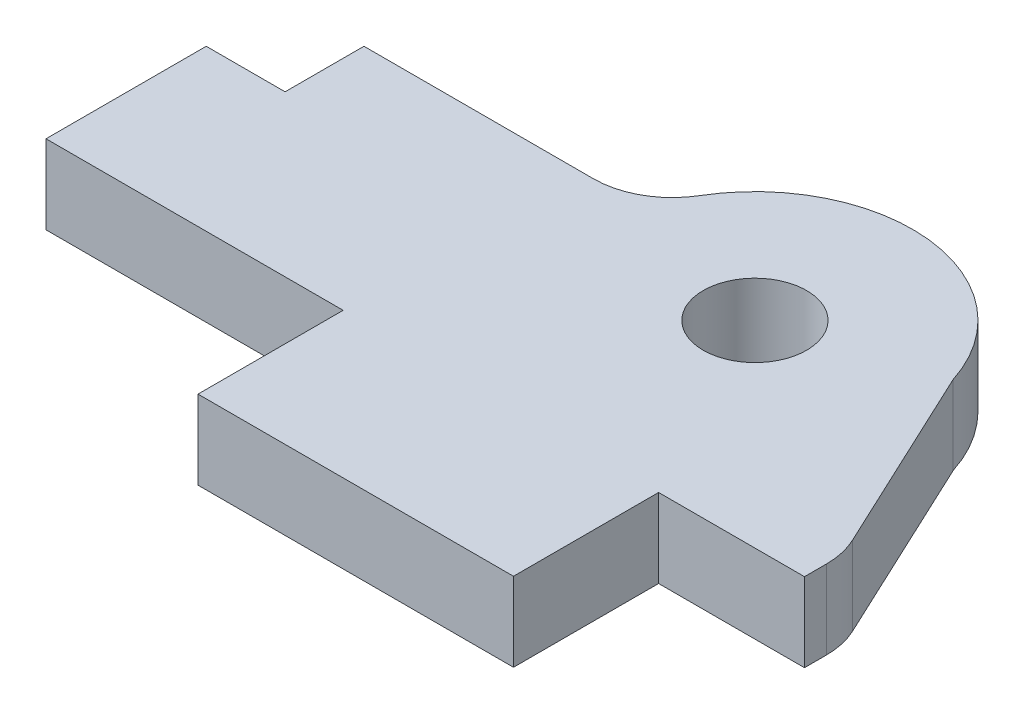
ISO-10303-21;
HEADER;
FILE_DESCRIPTION(('STEP AP214'),'2;1');
FILE_NAME('part.step','',(''),(''),'','','');
FILE_SCHEMA(('AUTOMOTIVE_DESIGN { 1 0 10303 214 1 1 1 1 }'));
ENDSEC;
DATA;
#1=APPLICATION_CONTEXT('core data for automotive mechanical design processes');
#2=APPLICATION_PROTOCOL_DEFINITION('international standard','automotive_design',2000,#1);
#3=PRODUCT_CONTEXT('',#1,'mechanical');
#4=PRODUCT('Part','Part','',(#3));
#5=PRODUCT_RELATED_PRODUCT_CATEGORY('part','',(#4));
#6=PRODUCT_DEFINITION_FORMATION('','',#4);
#7=PRODUCT_DEFINITION_CONTEXT('part definition',#1,'design');
#8=PRODUCT_DEFINITION('design','',#6,#7);
#9=PRODUCT_DEFINITION_SHAPE('','',#8);
#10=(LENGTH_UNIT() NAMED_UNIT(*) SI_UNIT(.MILLI.,.METRE.));
#11=(NAMED_UNIT(*) PLANE_ANGLE_UNIT() SI_UNIT($,.RADIAN.));
#12=(NAMED_UNIT(*) SI_UNIT($,.STERADIAN.) SOLID_ANGLE_UNIT());
#13=UNCERTAINTY_MEASURE_WITH_UNIT(LENGTH_MEASURE(1.E-05),#10,'distance_accuracy_value','');
#14=(GEOMETRIC_REPRESENTATION_CONTEXT(3) GLOBAL_UNCERTAINTY_ASSIGNED_CONTEXT((#13)) GLOBAL_UNIT_ASSIGNED_CONTEXT((#10,
#11,#12)) REPRESENTATION_CONTEXT('',''));
#15=CARTESIAN_POINT('',(0.,0.,0.));
#16=DIRECTION('',(0.,0.,1.));
#17=DIRECTION('',(1.,0.,0.));
#18=AXIS2_PLACEMENT_3D('',#15,#16,#17);
#19=CARTESIAN_POINT('',(2.28983543386667,3.175,-10.8585));
#20=DIRECTION('',(0.,1.,0.));
#21=DIRECTION('',(0.,0.,1.));
#22=AXIS2_PLACEMENT_3D('',#19,#20,#21);
#23=PLANE('',#22);
#24=DIRECTION('',(0.,0.,-1.));
#25=VECTOR('',#24,1.);
#26=CARTESIAN_POINT('',(12.2217907625333,3.175,-4.5085));
#27=LINE('',#26,#25);
#28=CARTESIAN_POINT('',(12.2217907625333,3.175,-2.921));
#29=VERTEX_POINT('',#28);
#30=CARTESIAN_POINT('',(12.2217907625333,3.175,-3.80113901896461));
#31=VERTEX_POINT('',#30);
#32=EDGE_CURVE('E268',#29,#31,#27,.T.);
#33=ORIENTED_EDGE('',*,*,#32,.T.);
#34=CARTESIAN_POINT('',(9.04679076253332,3.175,-3.80113901896461));
#35=DIRECTION('',(0.,1.,0.));
#36=DIRECTION('',(0.,0.,1.));
#37=AXIS2_PLACEMENT_3D('',#34,#35,#36);
#38=CIRCLE('',#37,3.175);
#39=CARTESIAN_POINT('',(11.9215083858975,3.175,-5.14896081205123));
#40=VERTEX_POINT('',#39);
#41=EDGE_CURVE('E172',#31,#40,#38,.T.);
#42=ORIENTED_EDGE('',*,*,#41,.T.);
#43=DIRECTION('',(-0.424510800972164,0.,-0.905422873500538));
#44=VECTOR('',#43,1.);
#45=CARTESIAN_POINT('',(8.3388925331072,3.175,-12.7901853289622));
#46=LINE('',#45,#44);
#47=CARTESIAN_POINT('',(8.3388925331072,3.175,-12.7901853289622));
#48=VERTEX_POINT('',#47);
#49=EDGE_CURVE('E206',#40,#48,#46,.T.);
#50=ORIENTED_EDGE('',*,*,#49,.T.);
#51=CARTESIAN_POINT('',(2.28983543386667,3.175,-10.8585));
#52=DIRECTION('',(0.,1.,0.));
#53=DIRECTION('',(0.,0.,1.));
#54=AXIS2_PLACEMENT_3D('',#51,#52,#53);
#55=CIRCLE('',#54,6.35);
#56=CARTESIAN_POINT('',(-3.1703932446982,3.175,-14.1001666666667));
#57=VERTEX_POINT('',#56);
#58=EDGE_CURVE('E202',#48,#57,#55,.T.);
#59=ORIENTED_EDGE('',*,*,#58,.T.);
#60=CARTESIAN_POINT('',(-5.90050758398063,3.175,-15.721));
#61=DIRECTION('',(0.,1.,0.));
#62=DIRECTION('',(0.,0.,1.));
#63=AXIS2_PLACEMENT_3D('',#60,#61,#62);
#64=CIRCLE('',#63,3.175);
#65=CARTESIAN_POINT('',(-5.90050758398063,3.175,-12.546));
#66=VERTEX_POINT('',#65);
#67=EDGE_CURVE('E11',#57,#66,#64,.F.);
#68=ORIENTED_EDGE('',*,*,#67,.T.);
#69=DIRECTION('',(-1.,0.,0.));
#70=VECTOR('',#69,1.);
#71=CARTESIAN_POINT('',(-13.2043715761333,3.175,-12.546));
#72=LINE('',#71,#70);
#73=CARTESIAN_POINT('',(-15.1361574001333,3.175,-12.546));
#74=VERTEX_POINT('',#73);
#75=EDGE_CURVE('E198',#66,#74,#72,.T.);
#76=ORIENTED_EDGE('',*,*,#75,.T.);
#77=DIRECTION('',(0.,0.,1.));
#78=VECTOR('',#77,1.);
#79=CARTESIAN_POINT('',(-15.1361574001333,3.175,-9.371));
#80=LINE('',#79,#78);
#81=CARTESIAN_POINT('',(-15.1361574001333,3.175,-9.371));
#82=VERTEX_POINT('',#81);
#83=EDGE_CURVE('E201',#74,#82,#80,.T.);
#84=ORIENTED_EDGE('',*,*,#83,.T.);
#85=DIRECTION('',(-1.,0.,0.));
#86=VECTOR('',#85,1.);
#87=CARTESIAN_POINT('',(-18.3111574001333,3.175,-9.371));
#88=LINE('',#87,#86);
#89=CARTESIAN_POINT('',(-18.3111574001333,3.175,-9.371));
#90=VERTEX_POINT('',#89);
#91=EDGE_CURVE('E204',#82,#90,#88,.T.);
#92=ORIENTED_EDGE('',*,*,#91,.T.);
#93=DIRECTION('',(0.,0.,1.));
#94=VECTOR('',#93,1.);
#95=CARTESIAN_POINT('',(-18.3111574001333,3.175,-2.921));
#96=LINE('',#95,#94);
#97=CARTESIAN_POINT('',(-18.3111574001333,3.175,-2.921));
#98=VERTEX_POINT('',#97);
#99=EDGE_CURVE('E151',#90,#98,#96,.T.);
#100=ORIENTED_EDGE('',*,*,#99,.T.);
#101=DIRECTION('',(1.,0.,0.));
#102=VECTOR('',#101,1.);
#103=CARTESIAN_POINT('',(-15.9500858374667,3.175,-2.921));
#104=LINE('',#103,#102);
#105=CARTESIAN_POINT('',(-6.35,3.175,-2.921));
#106=VERTEX_POINT('',#105);
#107=EDGE_CURVE('E145',#98,#106,#104,.T.);
#108=ORIENTED_EDGE('',*,*,#107,.T.);
#109=DIRECTION('',(0.,0.,1.));
#110=VECTOR('',#109,1.);
#111=CARTESIAN_POINT('',(-6.35,3.175,2.921));
#112=LINE('',#111,#110);
#113=CARTESIAN_POINT('',(-6.35,3.175,2.921));
#114=VERTEX_POINT('',#113);
#115=EDGE_CURVE('E136',#106,#114,#112,.T.);
#116=ORIENTED_EDGE('',*,*,#115,.T.);
#117=DIRECTION('',(1.,0.,0.));
#118=VECTOR('',#117,1.);
#119=CARTESIAN_POINT('',(6.35,3.175,2.921));
#120=LINE('',#119,#118);
#121=CARTESIAN_POINT('',(6.35,3.175,2.921));
#122=VERTEX_POINT('',#121);
#123=EDGE_CURVE('E144',#114,#122,#120,.T.);
#124=ORIENTED_EDGE('',*,*,#123,.T.);
#125=DIRECTION('',(0.,0.,-1.));
#126=VECTOR('',#125,1.);
#127=CARTESIAN_POINT('',(6.35,3.175,2.921));
#128=LINE('',#127,#126);
#129=CARTESIAN_POINT('',(6.35,3.175,-2.921));
#130=VERTEX_POINT('',#129);
#131=EDGE_CURVE('E255',#122,#130,#128,.T.);
#132=ORIENTED_EDGE('',*,*,#131,.T.);
#133=DIRECTION('',(1.,0.,0.));
#134=VECTOR('',#133,1.);
#135=CARTESIAN_POINT('',(12.2217907625333,3.175,-2.921));
#136=LINE('',#135,#134);
#137=EDGE_CURVE('E270',#130,#29,#136,.T.);
#138=ORIENTED_EDGE('',*,*,#137,.T.);
#139=EDGE_LOOP('',(#33,#42,#50,#59,#68,#76,#84,#92,#100,#108,#116,#124,#132,#138));
#140=FACE_BOUND('',#139,.T.);
#141=CARTESIAN_POINT('',(2.28983543386667,3.175,-10.8585));
#142=DIRECTION('',(0.,1.,0.));
#143=DIRECTION('',(0.,0.,1.));
#144=AXIS2_PLACEMENT_3D('',#141,#142,#143);
#145=CIRCLE('',#144,2.0828);
#146=CARTESIAN_POINT('',(2.28983543386667,3.175,-8.7757));
#147=VERTEX_POINT('',#146);
#148=EDGE_CURVE('E216',#147,#147,#145,.T.);
#149=ORIENTED_EDGE('',*,*,#148,.F.);
#150=EDGE_LOOP('',(#149));
#151=FACE_BOUND('',#150,.T.);
#152=ADVANCED_FACE('F35',(#140,#151),#23,.T.);
#153=CARTESIAN_POINT('',(2.28983543386667,0.,-10.8585));
#154=DIRECTION('',(0.,1.,0.));
#155=DIRECTION('',(0.,0.,1.));
#156=AXIS2_PLACEMENT_3D('',#153,#154,#155);
#157=PLANE('',#156);
#158=DIRECTION('',(-0.424510800972164,0.,-0.905422873500538));
#159=VECTOR('',#158,1.);
#160=CARTESIAN_POINT('',(8.3388925331072,0.,-12.7901853289622));
#161=LINE('',#160,#159);
#162=CARTESIAN_POINT('',(11.9215083858975,0.,-5.14896081205123));
#163=VERTEX_POINT('',#162);
#164=CARTESIAN_POINT('',(8.3388925331072,0.,-12.7901853289622));
#165=VERTEX_POINT('',#164);
#166=EDGE_CURVE('E192',#163,#165,#161,.T.);
#167=ORIENTED_EDGE('',*,*,#166,.F.);
#168=CARTESIAN_POINT('',(9.04679076253332,0.,-3.80113901896461));
#169=DIRECTION('',(0.,1.,0.));
#170=DIRECTION('',(0.,0.,1.));
#171=AXIS2_PLACEMENT_3D('',#168,#169,#170);
#172=CIRCLE('',#171,3.175);
#173=CARTESIAN_POINT('',(12.2217907625333,0.,-3.80113901896461));
#174=VERTEX_POINT('',#173);
#175=EDGE_CURVE('E163',#163,#174,#172,.F.);
#176=ORIENTED_EDGE('',*,*,#175,.T.);
#177=DIRECTION('',(0.,0.,-1.));
#178=VECTOR('',#177,1.);
#179=CARTESIAN_POINT('',(12.2217907625333,0.,-4.5085));
#180=LINE('',#179,#178);
#181=CARTESIAN_POINT('',(12.2217907625333,0.,-2.921));
#182=VERTEX_POINT('',#181);
#183=EDGE_CURVE('E222',#182,#174,#180,.T.);
#184=ORIENTED_EDGE('',*,*,#183,.F.);
#185=DIRECTION('',(1.,0.,0.));
#186=VECTOR('',#185,1.);
#187=CARTESIAN_POINT('',(12.2217907625333,0.,-2.921));
#188=LINE('',#187,#186);
#189=CARTESIAN_POINT('',(6.35,0.,-2.921));
#190=VERTEX_POINT('',#189);
#191=EDGE_CURVE('E220',#190,#182,#188,.T.);
#192=ORIENTED_EDGE('',*,*,#191,.F.);
#193=DIRECTION('',(0.,0.,-1.));
#194=VECTOR('',#193,1.);
#195=CARTESIAN_POINT('',(6.35,0.,2.921));
#196=LINE('',#195,#194);
#197=CARTESIAN_POINT('',(6.35,0.,2.921));
#198=VERTEX_POINT('',#197);
#199=EDGE_CURVE('E218',#198,#190,#196,.T.);
#200=ORIENTED_EDGE('',*,*,#199,.F.);
#201=DIRECTION('',(1.,0.,0.));
#202=VECTOR('',#201,1.);
#203=CARTESIAN_POINT('',(6.35,0.,2.921));
#204=LINE('',#203,#202);
#205=CARTESIAN_POINT('',(-6.35,0.,2.921));
#206=VERTEX_POINT('',#205);
#207=EDGE_CURVE('E215',#206,#198,#204,.T.);
#208=ORIENTED_EDGE('',*,*,#207,.F.);
#209=DIRECTION('',(0.,0.,1.));
#210=VECTOR('',#209,1.);
#211=CARTESIAN_POINT('',(-6.35,0.,2.921));
#212=LINE('',#211,#210);
#213=CARTESIAN_POINT('',(-6.35,0.,-2.921));
#214=VERTEX_POINT('',#213);
#215=EDGE_CURVE('E213',#214,#206,#212,.T.);
#216=ORIENTED_EDGE('',*,*,#215,.F.);
#217=DIRECTION('',(1.,0.,0.));
#218=VECTOR('',#217,1.);
#219=CARTESIAN_POINT('',(-15.9500858374667,0.,-2.921));
#220=LINE('',#219,#218);
#221=CARTESIAN_POINT('',(-18.3111574001333,0.,-2.921));
#222=VERTEX_POINT('',#221);
#223=EDGE_CURVE('E155',#222,#214,#220,.T.);
#224=ORIENTED_EDGE('',*,*,#223,.F.);
#225=DIRECTION('',(0.,0.,1.));
#226=VECTOR('',#225,1.);
#227=CARTESIAN_POINT('',(-18.3111574001333,0.,-2.921));
#228=LINE('',#227,#226);
#229=CARTESIAN_POINT('',(-18.3111574001333,0.,-9.371));
#230=VERTEX_POINT('',#229);
#231=EDGE_CURVE('E231',#230,#222,#228,.T.);
#232=ORIENTED_EDGE('',*,*,#231,.F.);
#233=DIRECTION('',(-1.,0.,0.));
#234=VECTOR('',#233,1.);
#235=CARTESIAN_POINT('',(-18.3111574001333,0.,-9.371));
#236=LINE('',#235,#234);
#237=CARTESIAN_POINT('',(-15.1361574001333,0.,-9.371));
#238=VERTEX_POINT('',#237);
#239=EDGE_CURVE('E229',#238,#230,#236,.T.);
#240=ORIENTED_EDGE('',*,*,#239,.F.);
#241=DIRECTION('',(0.,0.,1.));
#242=VECTOR('',#241,1.);
#243=CARTESIAN_POINT('',(-15.1361574001333,0.,-9.371));
#244=LINE('',#243,#242);
#245=CARTESIAN_POINT('',(-15.1361574001333,0.,-12.546));
#246=VERTEX_POINT('',#245);
#247=EDGE_CURVE('E227',#246,#238,#244,.T.);
#248=ORIENTED_EDGE('',*,*,#247,.F.);
#249=DIRECTION('',(-1.,0.,0.));
#250=VECTOR('',#249,1.);
#251=CARTESIAN_POINT('',(-15.1361574001333,0.,-12.546));
#252=LINE('',#251,#250);
#253=CARTESIAN_POINT('',(-5.90050758398063,0.,-12.546));
#254=VERTEX_POINT('',#253);
#255=EDGE_CURVE('E185',#254,#246,#252,.T.);
#256=ORIENTED_EDGE('',*,*,#255,.F.);
#257=CARTESIAN_POINT('',(-5.90050758398063,0.,-15.721));
#258=DIRECTION('',(0.,1.,0.));
#259=DIRECTION('',(0.,0.,1.));
#260=AXIS2_PLACEMENT_3D('',#257,#258,#259);
#261=CIRCLE('',#260,3.175);
#262=CARTESIAN_POINT('',(-3.1703932446982,0.,-14.1001666666667));
#263=VERTEX_POINT('',#262);
#264=EDGE_CURVE('E43',#254,#263,#261,.T.);
#265=ORIENTED_EDGE('',*,*,#264,.T.);
#266=CARTESIAN_POINT('',(2.28983543386667,0.,-10.8585));
#267=DIRECTION('',(0.,1.,0.));
#268=DIRECTION('',(0.,0.,1.));
#269=AXIS2_PLACEMENT_3D('',#266,#267,#268);
#270=CIRCLE('',#269,6.35);
#271=EDGE_CURVE('E183',#165,#263,#270,.T.);
#272=ORIENTED_EDGE('',*,*,#271,.F.);
#273=EDGE_LOOP('',(#167,#176,#184,#192,#200,#208,#216,#224,#232,#240,#248,#256,#265,#272));
#274=FACE_BOUND('',#273,.T.);
#275=CARTESIAN_POINT('',(2.28983543386667,0.,-10.8585));
#276=DIRECTION('',(0.,1.,0.));
#277=DIRECTION('',(0.,0.,1.));
#278=AXIS2_PLACEMENT_3D('',#275,#276,#277);
#279=CIRCLE('',#278,2.0828);
#280=CARTESIAN_POINT('',(2.28983543386667,0.,-8.7757));
#281=VERTEX_POINT('',#280);
#282=EDGE_CURVE('E276',#281,#281,#279,.T.);
#283=ORIENTED_EDGE('',*,*,#282,.T.);
#284=EDGE_LOOP('',(#283));
#285=FACE_BOUND('',#284,.T.);
#286=ADVANCED_FACE('F181',(#274,#285),#157,.F.);
#287=CARTESIAN_POINT('',(-6.35,3.175,2.921));
#288=DIRECTION('',(1.,0.,0.));
#289=DIRECTION('',(0.,0.,-1.));
#290=AXIS2_PLACEMENT_3D('',#287,#288,#289);
#291=PLANE('',#290);
#292=ORIENTED_EDGE('',*,*,#215,.T.);
#293=DIRECTION('',(0.,-1.,0.));
#294=VECTOR('',#293,1.);
#295=CARTESIAN_POINT('',(-6.35,3.175,2.921));
#296=LINE('',#295,#294);
#297=EDGE_CURVE('E142',#114,#206,#296,.T.);
#298=ORIENTED_EDGE('',*,*,#297,.F.);
#299=ORIENTED_EDGE('',*,*,#115,.F.);
#300=DIRECTION('',(0.,-1.,0.));
#301=VECTOR('',#300,1.);
#302=CARTESIAN_POINT('',(-6.35,3.175,-2.921));
#303=LINE('',#302,#301);
#304=EDGE_CURVE('E140',#106,#214,#303,.T.);
#305=ORIENTED_EDGE('',*,*,#304,.T.);
#306=EDGE_LOOP('',(#292,#298,#299,#305));
#307=FACE_BOUND('',#306,.T.);
#308=ADVANCED_FACE('F138',(#307),#291,.F.);
#309=CARTESIAN_POINT('',(6.35,3.175,2.921));
#310=DIRECTION('',(0.,0.,-1.));
#311=DIRECTION('',(-1.,0.,0.));
#312=AXIS2_PLACEMENT_3D('',#309,#310,#311);
#313=PLANE('',#312);
#314=ORIENTED_EDGE('',*,*,#207,.T.);
#315=DIRECTION('',(0.,-1.,0.));
#316=VECTOR('',#315,1.);
#317=CARTESIAN_POINT('',(6.35,3.175,2.921));
#318=LINE('',#317,#316);
#319=EDGE_CURVE('E165',#122,#198,#318,.T.);
#320=ORIENTED_EDGE('',*,*,#319,.F.);
#321=ORIENTED_EDGE('',*,*,#123,.F.);
#322=ORIENTED_EDGE('',*,*,#297,.T.);
#323=EDGE_LOOP('',(#314,#320,#321,#322));
#324=FACE_BOUND('',#323,.T.);
#325=ADVANCED_FACE('F320',(#324),#313,.F.);
#326=CARTESIAN_POINT('',(6.35,3.175,2.921));
#327=DIRECTION('',(-1.,0.,0.));
#328=DIRECTION('',(0.,0.,1.));
#329=AXIS2_PLACEMENT_3D('',#326,#327,#328);
#330=PLANE('',#329);
#331=ORIENTED_EDGE('',*,*,#199,.T.);
#332=DIRECTION('',(0.,-1.,0.));
#333=VECTOR('',#332,1.);
#334=CARTESIAN_POINT('',(6.35,3.175,-2.921));
#335=LINE('',#334,#333);
#336=EDGE_CURVE('E246',#130,#190,#335,.T.);
#337=ORIENTED_EDGE('',*,*,#336,.F.);
#338=ORIENTED_EDGE('',*,*,#131,.F.);
#339=ORIENTED_EDGE('',*,*,#319,.T.);
#340=EDGE_LOOP('',(#331,#337,#338,#339));
#341=FACE_BOUND('',#340,.T.);
#342=ADVANCED_FACE('F253',(#341),#330,.F.);
#343=CARTESIAN_POINT('',(12.2217907625333,3.175,-2.921));
#344=DIRECTION('',(0.,0.,-1.));
#345=DIRECTION('',(-1.,0.,0.));
#346=AXIS2_PLACEMENT_3D('',#343,#344,#345);
#347=PLANE('',#346);
#348=ORIENTED_EDGE('',*,*,#191,.T.);
#349=DIRECTION('',(0.,-1.,0.));
#350=VECTOR('',#349,1.);
#351=CARTESIAN_POINT('',(12.2217907625333,3.175,-2.921));
#352=LINE('',#351,#350);
#353=EDGE_CURVE('E243',#29,#182,#352,.T.);
#354=ORIENTED_EDGE('',*,*,#353,.F.);
#355=ORIENTED_EDGE('',*,*,#137,.F.);
#356=ORIENTED_EDGE('',*,*,#336,.T.);
#357=EDGE_LOOP('',(#348,#354,#355,#356));
#358=FACE_BOUND('',#357,.T.);
#359=ADVANCED_FACE('F262',(#358),#347,.F.);
#360=CARTESIAN_POINT('',(12.2217907625333,3.175,-4.5085));
#361=DIRECTION('',(-1.,0.,0.));
#362=DIRECTION('',(0.,0.,1.));
#363=AXIS2_PLACEMENT_3D('',#360,#361,#362);
#364=PLANE('',#363);
#365=ORIENTED_EDGE('',*,*,#183,.T.);
#366=DIRECTION('',(0.,-1.,0.));
#367=VECTOR('',#366,1.);
#368=CARTESIAN_POINT('',(12.2217907625333,3.175,-3.80113901896461));
#369=LINE('',#368,#367);
#370=EDGE_CURVE('E170',#174,#31,#369,.F.);
#371=ORIENTED_EDGE('',*,*,#370,.T.);
#372=ORIENTED_EDGE('',*,*,#32,.F.);
#373=ORIENTED_EDGE('',*,*,#353,.T.);
#374=EDGE_LOOP('',(#365,#371,#372,#373));
#375=FACE_BOUND('',#374,.T.);
#376=ADVANCED_FACE('F266',(#375),#364,.F.);
#377=CARTESIAN_POINT('',(8.3388925331072,3.175,-12.7901853289622));
#378=DIRECTION('',(-0.905422873500538,0.,0.424510800972164));
#379=DIRECTION('',(0.424510800972164,0.,0.905422873500538));
#380=AXIS2_PLACEMENT_3D('',#377,#378,#379);
#381=PLANE('',#380);
#382=ORIENTED_EDGE('',*,*,#49,.F.);
#383=DIRECTION('',(0.,-1.,0.));
#384=VECTOR('',#383,1.);
#385=CARTESIAN_POINT('',(11.9215083858975,3.175,-5.14896081205123));
#386=LINE('',#385,#384);
#387=EDGE_CURVE('E160',#40,#163,#386,.T.);
#388=ORIENTED_EDGE('',*,*,#387,.T.);
#389=ORIENTED_EDGE('',*,*,#166,.T.);
#390=DIRECTION('',(0.,-1.,0.));
#391=VECTOR('',#390,1.);
#392=CARTESIAN_POINT('',(8.3388925331072,3.175,-12.7901853289622));
#393=LINE('',#392,#391);
#394=EDGE_CURVE('E191',#48,#165,#393,.T.);
#395=ORIENTED_EDGE('',*,*,#394,.F.);
#396=EDGE_LOOP('',(#382,#388,#389,#395));
#397=FACE_BOUND('',#396,.T.);
#398=ADVANCED_FACE('F310',(#397),#381,.F.);
#399=CARTESIAN_POINT('',(2.28983543386667,3.175,-10.8585));
#400=DIRECTION('',(0.,-1.,0.));
#401=DIRECTION('',(0.,0.,-1.));
#402=AXIS2_PLACEMENT_3D('',#399,#400,#401);
#403=CYLINDRICAL_SURFACE('',#402,6.35);
#404=ORIENTED_EDGE('',*,*,#271,.T.);
#405=DIRECTION('',(0.,-1.,0.));
#406=VECTOR('',#405,1.);
#407=CARTESIAN_POINT('',(-3.1703932446982,3.175,-14.1001666666667));
#408=LINE('',#407,#406);
#409=EDGE_CURVE('E56',#263,#57,#408,.F.);
#410=ORIENTED_EDGE('',*,*,#409,.T.);
#411=ORIENTED_EDGE('',*,*,#58,.F.);
#412=ORIENTED_EDGE('',*,*,#394,.T.);
#413=EDGE_LOOP('',(#404,#410,#411,#412));
#414=FACE_BOUND('',#413,.T.);
#415=ADVANCED_FACE('F189',(#414),#403,.T.);
#416=CARTESIAN_POINT('',(-15.1361574001333,3.175,-12.546));
#417=DIRECTION('',(0.,0.,1.));
#418=DIRECTION('',(1.,0.,0.));
#419=AXIS2_PLACEMENT_3D('',#416,#417,#418);
#420=PLANE('',#419);
#421=ORIENTED_EDGE('',*,*,#75,.F.);
#422=DIRECTION('',(0.,1.,0.));
#423=VECTOR('',#422,1.);
#424=CARTESIAN_POINT('',(-5.90050758398063,0.,-12.546));
#425=LINE('',#424,#423);
#426=EDGE_CURVE('E174',#66,#254,#425,.F.);
#427=ORIENTED_EDGE('',*,*,#426,.T.);
#428=ORIENTED_EDGE('',*,*,#255,.T.);
#429=DIRECTION('',(0.,-1.,0.));
#430=VECTOR('',#429,1.);
#431=CARTESIAN_POINT('',(-15.1361574001333,3.175,-12.546));
#432=LINE('',#431,#430);
#433=EDGE_CURVE('E199',#74,#246,#432,.T.);
#434=ORIENTED_EDGE('',*,*,#433,.F.);
#435=EDGE_LOOP('',(#421,#427,#428,#434));
#436=FACE_BOUND('',#435,.T.);
#437=ADVANCED_FACE('F195',(#436),#420,.F.);
#438=CARTESIAN_POINT('',(-15.1361574001333,3.175,-9.371));
#439=DIRECTION('',(1.,0.,0.));
#440=DIRECTION('',(0.,0.,-1.));
#441=AXIS2_PLACEMENT_3D('',#438,#439,#440);
#442=PLANE('',#441);
#443=ORIENTED_EDGE('',*,*,#247,.T.);
#444=DIRECTION('',(0.,-1.,0.));
#445=VECTOR('',#444,1.);
#446=CARTESIAN_POINT('',(-15.1361574001333,3.175,-9.371));
#447=LINE('',#446,#445);
#448=EDGE_CURVE('E238',#82,#238,#447,.T.);
#449=ORIENTED_EDGE('',*,*,#448,.F.);
#450=ORIENTED_EDGE('',*,*,#83,.F.);
#451=ORIENTED_EDGE('',*,*,#433,.T.);
#452=EDGE_LOOP('',(#443,#449,#450,#451));
#453=FACE_BOUND('',#452,.T.);
#454=ADVANCED_FACE('F301',(#453),#442,.F.);
#455=CARTESIAN_POINT('',(-18.3111574001333,3.175,-9.371));
#456=DIRECTION('',(0.,0.,1.));
#457=DIRECTION('',(1.,0.,0.));
#458=AXIS2_PLACEMENT_3D('',#455,#456,#457);
#459=PLANE('',#458);
#460=ORIENTED_EDGE('',*,*,#239,.T.);
#461=DIRECTION('',(0.,-1.,0.));
#462=VECTOR('',#461,1.);
#463=CARTESIAN_POINT('',(-18.3111574001333,3.175,-9.371));
#464=LINE('',#463,#462);
#465=EDGE_CURVE('E235',#90,#230,#464,.T.);
#466=ORIENTED_EDGE('',*,*,#465,.F.);
#467=ORIENTED_EDGE('',*,*,#91,.F.);
#468=ORIENTED_EDGE('',*,*,#448,.T.);
#469=EDGE_LOOP('',(#460,#466,#467,#468));
#470=FACE_BOUND('',#469,.T.);
#471=ADVANCED_FACE('F297',(#470),#459,.F.);
#472=CARTESIAN_POINT('',(-18.3111574001333,3.175,-2.921));
#473=DIRECTION('',(1.,0.,0.));
#474=DIRECTION('',(0.,0.,-1.));
#475=AXIS2_PLACEMENT_3D('',#472,#473,#474);
#476=PLANE('',#475);
#477=ORIENTED_EDGE('',*,*,#231,.T.);
#478=DIRECTION('',(0.,-1.,0.));
#479=VECTOR('',#478,1.);
#480=CARTESIAN_POINT('',(-18.3111574001333,3.175,-2.921));
#481=LINE('',#480,#479);
#482=EDGE_CURVE('E212',#98,#222,#481,.T.);
#483=ORIENTED_EDGE('',*,*,#482,.F.);
#484=ORIENTED_EDGE('',*,*,#99,.F.);
#485=ORIENTED_EDGE('',*,*,#465,.T.);
#486=EDGE_LOOP('',(#477,#483,#484,#485));
#487=FACE_BOUND('',#486,.T.);
#488=ADVANCED_FACE('F294',(#487),#476,.F.);
#489=CARTESIAN_POINT('',(-15.9500858374667,3.175,-2.921));
#490=DIRECTION('',(0.,0.,-1.));
#491=DIRECTION('',(-1.,0.,0.));
#492=AXIS2_PLACEMENT_3D('',#489,#490,#491);
#493=PLANE('',#492);
#494=ORIENTED_EDGE('',*,*,#223,.T.);
#495=ORIENTED_EDGE('',*,*,#304,.F.);
#496=ORIENTED_EDGE('',*,*,#107,.F.);
#497=ORIENTED_EDGE('',*,*,#482,.T.);
#498=EDGE_LOOP('',(#494,#495,#496,#497));
#499=FACE_BOUND('',#498,.T.);
#500=ADVANCED_FACE('F157',(#499),#493,.F.);
#501=CARTESIAN_POINT('',(2.28983543386667,3.175,-10.8585));
#502=DIRECTION('',(0.,-1.,0.));
#503=DIRECTION('',(0.,0.,-1.));
#504=AXIS2_PLACEMENT_3D('',#501,#502,#503);
#505=CYLINDRICAL_SURFACE('',#504,2.0828);
#506=ORIENTED_EDGE('',*,*,#148,.T.);
#507=EDGE_LOOP('',(#506));
#508=FACE_BOUND('',#507,.T.);
#509=ORIENTED_EDGE('',*,*,#282,.F.);
#510=EDGE_LOOP('',(#509));
#511=FACE_BOUND('',#510,.T.);
#512=ADVANCED_FACE('F282',(#508,#511),#505,.F.);
#513=CARTESIAN_POINT('',(9.04679076253332,3.175,-3.80113901896461));
#514=DIRECTION('',(0.,-1.,0.));
#515=DIRECTION('',(0.,0.,-1.));
#516=AXIS2_PLACEMENT_3D('',#513,#514,#515);
#517=CYLINDRICAL_SURFACE('',#516,3.175);
#518=ORIENTED_EDGE('',*,*,#41,.F.);
#519=ORIENTED_EDGE('',*,*,#370,.F.);
#520=ORIENTED_EDGE('',*,*,#175,.F.);
#521=ORIENTED_EDGE('',*,*,#387,.F.);
#522=EDGE_LOOP('',(#518,#519,#520,#521));
#523=FACE_BOUND('',#522,.T.);
#524=ADVANCED_FACE('F324',(#523),#517,.T.);
#525=CARTESIAN_POINT('',(-5.90050758398063,3.175,-15.721));
#526=DIRECTION('',(0.,-1.,0.));
#527=DIRECTION('',(0.,0.,-1.));
#528=AXIS2_PLACEMENT_3D('',#525,#526,#527);
#529=CYLINDRICAL_SURFACE('',#528,3.175);
#530=ORIENTED_EDGE('',*,*,#67,.F.);
#531=ORIENTED_EDGE('',*,*,#409,.F.);
#532=ORIENTED_EDGE('',*,*,#264,.F.);
#533=ORIENTED_EDGE('',*,*,#426,.F.);
#534=EDGE_LOOP('',(#530,#531,#532,#533));
#535=FACE_BOUND('',#534,.T.);
#536=ADVANCED_FACE('F37',(#535),#529,.F.);
#537=CLOSED_SHELL('',(#152,#286,#308,#325,#342,#359,#376,#398,#415,#437,#454,#471,#488,#500,
#512,#524,#536));
#538=MANIFOLD_SOLID_BREP('B2',#537);
#539=ADVANCED_BREP_SHAPE_REPRESENTATION('',(#18,#538),#14);
#540=SHAPE_DEFINITION_REPRESENTATION(#9,#539);
ENDSEC;
END-ISO-10303-21;
